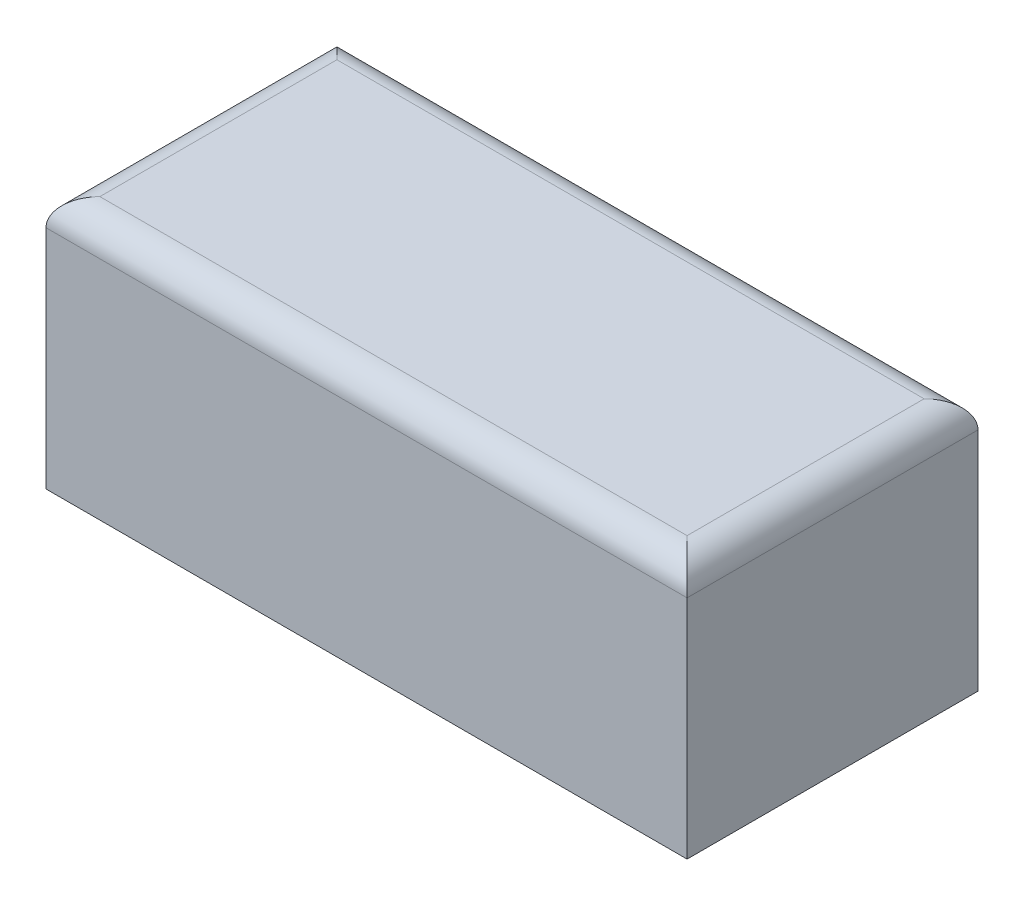
ISO-10303-21;
HEADER;
FILE_DESCRIPTION(('STEP AP214'),'2;1');
FILE_NAME('part.step','',(''),(''),'','','');
FILE_SCHEMA(('AUTOMOTIVE_DESIGN { 1 0 10303 214 1 1 1 1 }'));
ENDSEC;
DATA;
#1=APPLICATION_CONTEXT('core data for automotive mechanical design processes');
#2=APPLICATION_PROTOCOL_DEFINITION('international standard','automotive_design',2000,#1);
#3=PRODUCT_CONTEXT('',#1,'mechanical');
#4=PRODUCT('Part','Part','',(#3));
#5=PRODUCT_RELATED_PRODUCT_CATEGORY('part','',(#4));
#6=PRODUCT_DEFINITION_FORMATION('','',#4);
#7=PRODUCT_DEFINITION_CONTEXT('part definition',#1,'design');
#8=PRODUCT_DEFINITION('design','',#6,#7);
#9=PRODUCT_DEFINITION_SHAPE('','',#8);
#10=(LENGTH_UNIT() NAMED_UNIT(*) SI_UNIT(.MILLI.,.METRE.));
#11=(NAMED_UNIT(*) PLANE_ANGLE_UNIT() SI_UNIT($,.RADIAN.));
#12=(NAMED_UNIT(*) SI_UNIT($,.STERADIAN.) SOLID_ANGLE_UNIT());
#13=UNCERTAINTY_MEASURE_WITH_UNIT(LENGTH_MEASURE(1.E-05),#10,'distance_accuracy_value','');
#14=(GEOMETRIC_REPRESENTATION_CONTEXT(3) GLOBAL_UNCERTAINTY_ASSIGNED_CONTEXT((#13)) GLOBAL_UNIT_ASSIGNED_CONTEXT((#10,
#11,#12)) REPRESENTATION_CONTEXT('',''));
#15=CARTESIAN_POINT('',(0.,0.,0.));
#16=DIRECTION('',(0.,0.,1.));
#17=DIRECTION('',(1.,0.,0.));
#18=AXIS2_PLACEMENT_3D('',#15,#16,#17);
#19=CARTESIAN_POINT('',(0.,8.,0.));
#20=DIRECTION('',(0.,1.,0.));
#21=DIRECTION('',(0.,0.,1.));
#22=AXIS2_PLACEMENT_3D('',#19,#20,#21);
#23=PLANE('',#22);
#24=DIRECTION('',(1.,0.,0.));
#25=VECTOR('',#24,1.);
#26=CARTESIAN_POINT('',(0.,8.,-51.5));
#27=LINE('',#26,#25);
#28=CARTESIAN_POINT('',(-1.5,8.,-51.5));
#29=VERTEX_POINT('',#28);
#30=CARTESIAN_POINT('',(116.5,8.,-51.5));
#31=VERTEX_POINT('',#30);
#32=EDGE_CURVE('E164',#29,#31,#27,.T.);
#33=ORIENTED_EDGE('',*,*,#32,.F.);
#34=DIRECTION('',(0.,0.,-1.));
#35=VECTOR('',#34,1.);
#36=CARTESIAN_POINT('',(-1.5,8.,0.));
#37=LINE('',#36,#35);
#38=CARTESIAN_POINT('',(-1.5,8.,1.5));
#39=VERTEX_POINT('',#38);
#40=EDGE_CURVE('E145',#39,#29,#37,.T.);
#41=ORIENTED_EDGE('',*,*,#40,.F.);
#42=DIRECTION('',(-1.,0.,0.));
#43=VECTOR('',#42,1.);
#44=CARTESIAN_POINT('',(0.,8.,1.5));
#45=LINE('',#44,#43);
#46=CARTESIAN_POINT('',(116.5,8.,1.5));
#47=VERTEX_POINT('',#46);
#48=EDGE_CURVE('E157',#47,#39,#45,.T.);
#49=ORIENTED_EDGE('',*,*,#48,.F.);
#50=DIRECTION('',(0.,0.,1.));
#51=VECTOR('',#50,1.);
#52=CARTESIAN_POINT('',(116.5,8.,0.));
#53=LINE('',#52,#51);
#54=EDGE_CURVE('E166',#31,#47,#53,.T.);
#55=ORIENTED_EDGE('',*,*,#54,.F.);
#56=EDGE_LOOP('',(#33,#41,#49,#55));
#57=FACE_BOUND('',#56,.T.);
#58=DIRECTION('',(0.,0.,1.));
#59=VECTOR('',#58,1.);
#60=CARTESIAN_POINT('',(-2.,8.,-52.));
#61=LINE('',#60,#59);
#62=CARTESIAN_POINT('',(-2.,8.,-52.));
#63=VERTEX_POINT('',#62);
#64=CARTESIAN_POINT('',(-1.99999999999999,8.,2.));
#65=VERTEX_POINT('',#64);
#66=EDGE_CURVE('E213',#63,#65,#61,.T.);
#67=ORIENTED_EDGE('',*,*,#66,.F.);
#68=DIRECTION('',(-1.,0.,0.));
#69=VECTOR('',#68,1.);
#70=CARTESIAN_POINT('',(117.,8.,-52.));
#71=LINE('',#70,#69);
#72=CARTESIAN_POINT('',(117.,8.,-52.));
#73=VERTEX_POINT('',#72);
#74=EDGE_CURVE('E222',#73,#63,#71,.T.);
#75=ORIENTED_EDGE('',*,*,#74,.F.);
#76=DIRECTION('',(0.,0.,-1.));
#77=VECTOR('',#76,1.);
#78=CARTESIAN_POINT('',(117.,8.,1.99999999999999));
#79=LINE('',#78,#77);
#80=CARTESIAN_POINT('',(117.,8.,1.99999999999999));
#81=VERTEX_POINT('',#80);
#82=EDGE_CURVE('E219',#81,#73,#79,.T.);
#83=ORIENTED_EDGE('',*,*,#82,.F.);
#84=DIRECTION('',(1.,0.,0.));
#85=VECTOR('',#84,1.);
#86=CARTESIAN_POINT('',(-1.99999999999999,8.,2.));
#87=LINE('',#86,#85);
#88=EDGE_CURVE('E216',#65,#81,#87,.T.);
#89=ORIENTED_EDGE('',*,*,#88,.F.);
#90=EDGE_LOOP('',(#67,#75,#83,#89));
#91=FACE_BOUND('',#90,.T.);
#92=ADVANCED_FACE('F39',(#57,#91),#23,.F.);
#93=CARTESIAN_POINT('',(-2.,53.,-52.));
#94=DIRECTION('',(1.,0.,0.));
#95=DIRECTION('',(0.,0.,-1.));
#96=AXIS2_PLACEMENT_3D('',#93,#94,#95);
#97=PLANE('',#96);
#98=DIRECTION('',(0.,-1.,0.));
#99=VECTOR('',#98,1.);
#100=CARTESIAN_POINT('',(-1.99999999999999,53.,2.));
#101=LINE('',#100,#99);
#102=CARTESIAN_POINT('',(-1.99999999999999,50.,2.));
#103=VERTEX_POINT('',#102);
#104=EDGE_CURVE('E231',#103,#65,#101,.T.);
#105=ORIENTED_EDGE('',*,*,#104,.F.);
#106=DIRECTION('',(0.,0.,1.));
#107=VECTOR('',#106,1.);
#108=CARTESIAN_POINT('',(-2.,50.,-52.));
#109=LINE('',#108,#107);
#110=CARTESIAN_POINT('',(-2.,50.,-52.));
#111=VERTEX_POINT('',#110);
#112=EDGE_CURVE('E48',#103,#111,#109,.F.);
#113=ORIENTED_EDGE('',*,*,#112,.T.);
#114=DIRECTION('',(0.,-1.,0.));
#115=VECTOR('',#114,1.);
#116=CARTESIAN_POINT('',(-2.,53.,-52.));
#117=LINE('',#116,#115);
#118=EDGE_CURVE('E225',#111,#63,#117,.T.);
#119=ORIENTED_EDGE('',*,*,#118,.T.);
#120=ORIENTED_EDGE('',*,*,#66,.T.);
#121=EDGE_LOOP('',(#105,#113,#119,#120));
#122=FACE_BOUND('',#121,.T.);
#123=ADVANCED_FACE('F294',(#122),#97,.F.);
#124=CARTESIAN_POINT('',(-1.99999999999999,53.,2.));
#125=DIRECTION('',(0.,0.,-1.));
#126=DIRECTION('',(-1.,0.,0.));
#127=AXIS2_PLACEMENT_3D('',#124,#125,#126);
#128=PLANE('',#127);
#129=DIRECTION('',(0.,-1.,0.));
#130=VECTOR('',#129,1.);
#131=CARTESIAN_POINT('',(117.,53.,1.99999999999999));
#132=LINE('',#131,#130);
#133=CARTESIAN_POINT('',(117.,50.,1.99999999999999));
#134=VERTEX_POINT('',#133);
#135=EDGE_CURVE('E229',#134,#81,#132,.T.);
#136=ORIENTED_EDGE('',*,*,#135,.F.);
#137=DIRECTION('',(1.,0.,0.));
#138=VECTOR('',#137,1.);
#139=CARTESIAN_POINT('',(-1.99999999999999,50.,2.));
#140=LINE('',#139,#138);
#141=EDGE_CURVE('E63',#134,#103,#140,.F.);
#142=ORIENTED_EDGE('',*,*,#141,.T.);
#143=ORIENTED_EDGE('',*,*,#104,.T.);
#144=ORIENTED_EDGE('',*,*,#88,.T.);
#145=EDGE_LOOP('',(#136,#142,#143,#144));
#146=FACE_BOUND('',#145,.T.);
#147=ADVANCED_FACE('F301',(#146),#128,.F.);
#148=CARTESIAN_POINT('',(117.,53.,1.99999999999999));
#149=DIRECTION('',(-1.,0.,0.));
#150=DIRECTION('',(0.,0.,1.));
#151=AXIS2_PLACEMENT_3D('',#148,#149,#150);
#152=PLANE('',#151);
#153=DIRECTION('',(0.,-1.,0.));
#154=VECTOR('',#153,1.);
#155=CARTESIAN_POINT('',(117.,53.,-52.));
#156=LINE('',#155,#154);
#157=CARTESIAN_POINT('',(117.,50.,-52.));
#158=VERTEX_POINT('',#157);
#159=EDGE_CURVE('E227',#158,#73,#156,.T.);
#160=ORIENTED_EDGE('',*,*,#159,.F.);
#161=DIRECTION('',(0.,0.,-1.));
#162=VECTOR('',#161,1.);
#163=CARTESIAN_POINT('',(117.,50.,1.99999999999999));
#164=LINE('',#163,#162);
#165=EDGE_CURVE('E244',#158,#134,#164,.F.);
#166=ORIENTED_EDGE('',*,*,#165,.T.);
#167=ORIENTED_EDGE('',*,*,#135,.T.);
#168=ORIENTED_EDGE('',*,*,#82,.T.);
#169=EDGE_LOOP('',(#160,#166,#167,#168));
#170=FACE_BOUND('',#169,.T.);
#171=ADVANCED_FACE('F273',(#170),#152,.F.);
#172=CARTESIAN_POINT('',(117.,53.,-52.));
#173=DIRECTION('',(0.,0.,1.));
#174=DIRECTION('',(1.,0.,0.));
#175=AXIS2_PLACEMENT_3D('',#172,#173,#174);
#176=PLANE('',#175);
#177=ORIENTED_EDGE('',*,*,#118,.F.);
#178=DIRECTION('',(-1.,0.,0.));
#179=VECTOR('',#178,1.);
#180=CARTESIAN_POINT('',(117.,50.,-52.));
#181=LINE('',#180,#179);
#182=EDGE_CURVE('E12',#111,#158,#181,.F.);
#183=ORIENTED_EDGE('',*,*,#182,.T.);
#184=ORIENTED_EDGE('',*,*,#159,.T.);
#185=ORIENTED_EDGE('',*,*,#74,.T.);
#186=EDGE_LOOP('',(#177,#183,#184,#185));
#187=FACE_BOUND('',#186,.T.);
#188=ADVANCED_FACE('F270',(#187),#176,.F.);
#189=CARTESIAN_POINT('',(0.,55.,0.));
#190=DIRECTION('',(0.,1.,0.));
#191=DIRECTION('',(0.,0.,1.));
#192=AXIS2_PLACEMENT_3D('',#189,#190,#191);
#193=PLANE('',#192);
#194=DIRECTION('',(1.,0.,0.));
#195=VECTOR('',#194,1.);
#196=CARTESIAN_POINT('',(117.,55.,-3.00000000000001));
#197=LINE('',#196,#195);
#198=CARTESIAN_POINT('',(3.00000000000001,55.,-3.));
#199=VERTEX_POINT('',#198);
#200=CARTESIAN_POINT('',(112.,55.,-3.00000000000001));
#201=VERTEX_POINT('',#200);
#202=EDGE_CURVE('E239',#199,#201,#197,.T.);
#203=ORIENTED_EDGE('',*,*,#202,.T.);
#204=DIRECTION('',(0.,0.,-1.));
#205=VECTOR('',#204,1.);
#206=CARTESIAN_POINT('',(112.,55.,-52.));
#207=LINE('',#206,#205);
#208=CARTESIAN_POINT('',(112.,55.,-47.));
#209=VERTEX_POINT('',#208);
#210=EDGE_CURVE('E241',#201,#209,#207,.T.);
#211=ORIENTED_EDGE('',*,*,#210,.T.);
#212=DIRECTION('',(-1.,0.,0.));
#213=VECTOR('',#212,1.);
#214=CARTESIAN_POINT('',(-2.,55.,-47.));
#215=LINE('',#214,#213);
#216=CARTESIAN_POINT('',(3.,55.,-47.));
#217=VERTEX_POINT('',#216);
#218=EDGE_CURVE('E235',#209,#217,#215,.T.);
#219=ORIENTED_EDGE('',*,*,#218,.T.);
#220=DIRECTION('',(0.,0.,1.));
#221=VECTOR('',#220,1.);
#222=CARTESIAN_POINT('',(3.00000000000001,55.,2.));
#223=LINE('',#222,#221);
#224=EDGE_CURVE('E237',#217,#199,#223,.T.);
#225=ORIENTED_EDGE('',*,*,#224,.T.);
#226=EDGE_LOOP('',(#203,#211,#219,#225));
#227=FACE_BOUND('',#226,.T.);
#228=ADVANCED_FACE('F280',(#227),#193,.T.);
#229=CARTESIAN_POINT('',(-1.5,8.,0.));
#230=DIRECTION('',(-0.998629534754574,0.0523359562429438,0.));
#231=DIRECTION('',(-0.0523359562429438,-0.998629534754574,0.));
#232=AXIS2_PLACEMENT_3D('',#229,#230,#231);
#233=PLANE('',#232);
#234=ORIENTED_EDGE('',*,*,#40,.T.);
#235=DIRECTION('',(-0.0522644276887139,-0.997264688634237,-0.0522644276887139));
#236=VECTOR('',#235,1.);
#237=CARTESIAN_POINT('',(-1.35932412431612,10.68425561259,-51.3593241243161));
#238=LINE('',#237,#236);
#239=CARTESIAN_POINT('',(-1.39518444143392,10.,-51.3951844414339));
#240=VERTEX_POINT('',#239);
#241=EDGE_CURVE('E172',#240,#29,#238,.T.);
#242=ORIENTED_EDGE('',*,*,#241,.F.);
#243=DIRECTION('',(0.,0.,-1.));
#244=VECTOR('',#243,1.);
#245=CARTESIAN_POINT('',(-1.39518444143392,10.,0.));
#246=LINE('',#245,#244);
#247=CARTESIAN_POINT('',(-1.39518444143392,10.,1.39518444143392));
#248=VERTEX_POINT('',#247);
#249=EDGE_CURVE('E148',#248,#240,#246,.T.);
#250=ORIENTED_EDGE('',*,*,#249,.F.);
#251=DIRECTION('',(-0.0522644276887139,-0.997264688634237,0.0522644276887139));
#252=VECTOR('',#251,1.);
#253=CARTESIAN_POINT('',(-1.49590264439756,8.07818220230845,1.49590264439756));
#254=LINE('',#253,#252);
#255=EDGE_CURVE('E141',#248,#39,#254,.T.);
#256=ORIENTED_EDGE('',*,*,#255,.T.);
#257=EDGE_LOOP('',(#234,#242,#250,#256));
#258=FACE_BOUND('',#257,.T.);
#259=ADVANCED_FACE('F143',(#258),#233,.F.);
#260=CARTESIAN_POINT('',(0.,8.,-51.5));
#261=DIRECTION('',(0.,0.0523359562429438,-0.998629534754574));
#262=DIRECTION('',(0.,0.998629534754574,0.0523359562429438));
#263=AXIS2_PLACEMENT_3D('',#260,#261,#262);
#264=PLANE('',#263);
#265=ORIENTED_EDGE('',*,*,#32,.T.);
#266=DIRECTION('',(0.0522644276887139,-0.997264688634237,-0.0522644276887139));
#267=VECTOR('',#266,1.);
#268=CARTESIAN_POINT('',(116.18177204821,14.0721510459561,-51.1817720482102));
#269=LINE('',#268,#267);
#270=CARTESIAN_POINT('',(116.395184441434,10.,-51.3951844414339));
#271=VERTEX_POINT('',#270);
#272=EDGE_CURVE('E170',#271,#31,#269,.T.);
#273=ORIENTED_EDGE('',*,*,#272,.F.);
#274=DIRECTION('',(1.,0.,0.));
#275=VECTOR('',#274,1.);
#276=CARTESIAN_POINT('',(0.,10.,-51.3951844414339));
#277=LINE('',#276,#275);
#278=EDGE_CURVE('E178',#240,#271,#277,.T.);
#279=ORIENTED_EDGE('',*,*,#278,.F.);
#280=ORIENTED_EDGE('',*,*,#241,.T.);
#281=EDGE_LOOP('',(#265,#273,#279,#280));
#282=FACE_BOUND('',#281,.T.);
#283=ADVANCED_FACE('F288',(#282),#264,.F.);
#284=CARTESIAN_POINT('',(116.5,8.,0.));
#285=DIRECTION('',(0.998629534754574,0.0523359562429438,0.));
#286=DIRECTION('',(-0.0523359562429438,0.998629534754574,0.));
#287=AXIS2_PLACEMENT_3D('',#284,#285,#286);
#288=PLANE('',#287);
#289=ORIENTED_EDGE('',*,*,#54,.T.);
#290=DIRECTION('',(0.0522644276887139,-0.997264688634237,0.0522644276887139));
#291=VECTOR('',#290,1.);
#292=CARTESIAN_POINT('',(116.495902644398,8.07818220230845,1.49590264439756));
#293=LINE('',#292,#291);
#294=CARTESIAN_POINT('',(116.395184441434,10.,1.39518444143392));
#295=VERTEX_POINT('',#294);
#296=EDGE_CURVE('E152',#295,#47,#293,.T.);
#297=ORIENTED_EDGE('',*,*,#296,.F.);
#298=DIRECTION('',(0.,0.,1.));
#299=VECTOR('',#298,1.);
#300=CARTESIAN_POINT('',(116.395184441434,10.,0.));
#301=LINE('',#300,#299);
#302=EDGE_CURVE('E153',#271,#295,#301,.T.);
#303=ORIENTED_EDGE('',*,*,#302,.F.);
#304=ORIENTED_EDGE('',*,*,#272,.T.);
#305=EDGE_LOOP('',(#289,#297,#303,#304));
#306=FACE_BOUND('',#305,.T.);
#307=ADVANCED_FACE('F365',(#306),#288,.F.);
#308=CARTESIAN_POINT('',(0.,8.,1.5));
#309=DIRECTION('',(0.,0.0523359562429438,0.998629534754574));
#310=DIRECTION('',(0.,-0.998629534754574,0.0523359562429438));
#311=AXIS2_PLACEMENT_3D('',#308,#309,#310);
#312=PLANE('',#311);
#313=ORIENTED_EDGE('',*,*,#48,.T.);
#314=ORIENTED_EDGE('',*,*,#255,.F.);
#315=DIRECTION('',(-1.,0.,0.));
#316=VECTOR('',#315,1.);
#317=CARTESIAN_POINT('',(0.,10.,1.39518444143392));
#318=LINE('',#317,#316);
#319=EDGE_CURVE('E182',#295,#248,#318,.T.);
#320=ORIENTED_EDGE('',*,*,#319,.F.);
#321=ORIENTED_EDGE('',*,*,#296,.T.);
#322=EDGE_LOOP('',(#313,#314,#320,#321));
#323=FACE_BOUND('',#322,.T.);
#324=ADVANCED_FACE('F158',(#323),#312,.F.);
#325=CARTESIAN_POINT('',(0.,10.,0.));
#326=DIRECTION('',(0.,1.,0.));
#327=DIRECTION('',(0.,0.,1.));
#328=AXIS2_PLACEMENT_3D('',#325,#326,#327);
#329=PLANE('',#328);
#330=DIRECTION('',(-1.,0.,0.));
#331=VECTOR('',#330,1.);
#332=CARTESIAN_POINT('',(115.5,10.,-50.5));
#333=LINE('',#332,#331);
#334=CARTESIAN_POINT('',(115.5,10.,-50.5));
#335=VERTEX_POINT('',#334);
#336=CARTESIAN_POINT('',(-0.5,10.,-50.5));
#337=VERTEX_POINT('',#336);
#338=EDGE_CURVE('E187',#335,#337,#333,.T.);
#339=ORIENTED_EDGE('',*,*,#338,.T.);
#340=DIRECTION('',(0.,0.,1.));
#341=VECTOR('',#340,1.);
#342=CARTESIAN_POINT('',(-0.5,10.,-50.5));
#343=LINE('',#342,#341);
#344=CARTESIAN_POINT('',(-0.5,10.,0.5));
#345=VERTEX_POINT('',#344);
#346=EDGE_CURVE('E185',#337,#345,#343,.T.);
#347=ORIENTED_EDGE('',*,*,#346,.T.);
#348=DIRECTION('',(1.,0.,0.));
#349=VECTOR('',#348,1.);
#350=CARTESIAN_POINT('',(-0.5,10.,0.5));
#351=LINE('',#350,#349);
#352=CARTESIAN_POINT('',(115.5,10.,0.5));
#353=VERTEX_POINT('',#352);
#354=EDGE_CURVE('E174',#345,#353,#351,.T.);
#355=ORIENTED_EDGE('',*,*,#354,.T.);
#356=DIRECTION('',(0.,0.,-1.));
#357=VECTOR('',#356,1.);
#358=CARTESIAN_POINT('',(115.5,10.,-2.5));
#359=LINE('',#358,#357);
#360=EDGE_CURVE('E233',#353,#335,#359,.T.);
#361=ORIENTED_EDGE('',*,*,#360,.T.);
#362=EDGE_LOOP('',(#339,#347,#355,#361));
#363=FACE_BOUND('',#362,.T.);
#364=ORIENTED_EDGE('',*,*,#249,.T.);
#365=ORIENTED_EDGE('',*,*,#278,.T.);
#366=ORIENTED_EDGE('',*,*,#302,.T.);
#367=ORIENTED_EDGE('',*,*,#319,.T.);
#368=EDGE_LOOP('',(#364,#365,#366,#367));
#369=FACE_BOUND('',#368,.T.);
#370=ADVANCED_FACE('F344',(#363,#369),#329,.F.);
#371=CARTESIAN_POINT('',(0.,53.,0.));
#372=DIRECTION('',(0.,1.,0.));
#373=DIRECTION('',(0.,0.,1.));
#374=AXIS2_PLACEMENT_3D('',#371,#372,#373);
#375=PLANE('',#374);
#376=DIRECTION('',(0.,0.,1.));
#377=VECTOR('',#376,1.);
#378=CARTESIAN_POINT('',(-0.5,53.,-50.5));
#379=LINE('',#378,#377);
#380=CARTESIAN_POINT('',(-0.5,53.,-50.5));
#381=VERTEX_POINT('',#380);
#382=CARTESIAN_POINT('',(-0.5,53.,0.5));
#383=VERTEX_POINT('',#382);
#384=EDGE_CURVE('E195',#381,#383,#379,.T.);
#385=ORIENTED_EDGE('',*,*,#384,.F.);
#386=DIRECTION('',(-1.,0.,0.));
#387=VECTOR('',#386,1.);
#388=CARTESIAN_POINT('',(115.5,53.,-50.5));
#389=LINE('',#388,#387);
#390=CARTESIAN_POINT('',(115.5,53.,-50.5));
#391=VERTEX_POINT('',#390);
#392=EDGE_CURVE('E192',#391,#381,#389,.T.);
#393=ORIENTED_EDGE('',*,*,#392,.F.);
#394=DIRECTION('',(0.,0.,-1.));
#395=VECTOR('',#394,1.);
#396=CARTESIAN_POINT('',(115.5,53.,-47.5));
#397=LINE('',#396,#395);
#398=CARTESIAN_POINT('',(115.5,53.,0.5));
#399=VERTEX_POINT('',#398);
#400=EDGE_CURVE('E189',#399,#391,#397,.T.);
#401=ORIENTED_EDGE('',*,*,#400,.F.);
#402=DIRECTION('',(1.,0.,0.));
#403=VECTOR('',#402,1.);
#404=CARTESIAN_POINT('',(-0.5,53.,0.5));
#405=LINE('',#404,#403);
#406=EDGE_CURVE('E198',#383,#399,#405,.T.);
#407=ORIENTED_EDGE('',*,*,#406,.F.);
#408=EDGE_LOOP('',(#385,#393,#401,#407));
#409=FACE_BOUND('',#408,.T.);
#410=ADVANCED_FACE('F341',(#409),#375,.F.);
#411=CARTESIAN_POINT('',(115.5,53.,-2.5));
#412=DIRECTION('',(-1.,0.,0.));
#413=DIRECTION('',(0.,0.,1.));
#414=AXIS2_PLACEMENT_3D('',#411,#412,#413);
#415=PLANE('',#414);
#416=ORIENTED_EDGE('',*,*,#360,.F.);
#417=DIRECTION('',(0.,-1.,0.));
#418=VECTOR('',#417,1.);
#419=CARTESIAN_POINT('',(115.5,53.,0.5));
#420=LINE('',#419,#418);
#421=EDGE_CURVE('E201',#399,#353,#420,.T.);
#422=ORIENTED_EDGE('',*,*,#421,.F.);
#423=ORIENTED_EDGE('',*,*,#400,.T.);
#424=DIRECTION('',(0.,-1.,0.));
#425=VECTOR('',#424,1.);
#426=CARTESIAN_POINT('',(115.5,53.,-50.5));
#427=LINE('',#426,#425);
#428=EDGE_CURVE('E210',#391,#335,#427,.T.);
#429=ORIENTED_EDGE('',*,*,#428,.T.);
#430=EDGE_LOOP('',(#416,#422,#423,#429));
#431=FACE_BOUND('',#430,.T.);
#432=ADVANCED_FACE('F338',(#431),#415,.T.);
#433=CARTESIAN_POINT('',(-0.5,53.,0.5));
#434=DIRECTION('',(0.,0.,-1.));
#435=DIRECTION('',(-1.,0.,0.));
#436=AXIS2_PLACEMENT_3D('',#433,#434,#435);
#437=PLANE('',#436);
#438=ORIENTED_EDGE('',*,*,#354,.F.);
#439=DIRECTION('',(0.,-1.,0.));
#440=VECTOR('',#439,1.);
#441=CARTESIAN_POINT('',(-0.5,53.,0.5));
#442=LINE('',#441,#440);
#443=EDGE_CURVE('E204',#383,#345,#442,.T.);
#444=ORIENTED_EDGE('',*,*,#443,.F.);
#445=ORIENTED_EDGE('',*,*,#406,.T.);
#446=ORIENTED_EDGE('',*,*,#421,.T.);
#447=EDGE_LOOP('',(#438,#444,#445,#446));
#448=FACE_BOUND('',#447,.T.);
#449=ADVANCED_FACE('F329',(#448),#437,.T.);
#450=CARTESIAN_POINT('',(-0.5,53.,-50.5));
#451=DIRECTION('',(1.,0.,0.));
#452=DIRECTION('',(0.,0.,-1.));
#453=AXIS2_PLACEMENT_3D('',#450,#451,#452);
#454=PLANE('',#453);
#455=ORIENTED_EDGE('',*,*,#346,.F.);
#456=DIRECTION('',(0.,-1.,0.));
#457=VECTOR('',#456,1.);
#458=CARTESIAN_POINT('',(-0.5,53.,-50.5));
#459=LINE('',#458,#457);
#460=EDGE_CURVE('E207',#381,#337,#459,.T.);
#461=ORIENTED_EDGE('',*,*,#460,.F.);
#462=ORIENTED_EDGE('',*,*,#384,.T.);
#463=ORIENTED_EDGE('',*,*,#443,.T.);
#464=EDGE_LOOP('',(#455,#461,#462,#463));
#465=FACE_BOUND('',#464,.T.);
#466=ADVANCED_FACE('F323',(#465),#454,.T.);
#467=CARTESIAN_POINT('',(115.5,53.,-50.5));
#468=DIRECTION('',(0.,0.,1.));
#469=DIRECTION('',(1.,0.,0.));
#470=AXIS2_PLACEMENT_3D('',#467,#468,#469);
#471=PLANE('',#470);
#472=ORIENTED_EDGE('',*,*,#338,.F.);
#473=ORIENTED_EDGE('',*,*,#428,.F.);
#474=ORIENTED_EDGE('',*,*,#392,.T.);
#475=ORIENTED_EDGE('',*,*,#460,.T.);
#476=EDGE_LOOP('',(#472,#473,#474,#475));
#477=FACE_BOUND('',#476,.T.);
#478=ADVANCED_FACE('F304',(#477),#471,.T.);
#479=CARTESIAN_POINT('',(3.00000000000001,50.,0.));
#480=DIRECTION('',(0.,0.,-1.));
#481=DIRECTION('',(-1.,0.,0.));
#482=AXIS2_PLACEMENT_3D('',#479,#480,#481);
#483=CYLINDRICAL_SURFACE('',#482,5.);
#484=CARTESIAN_POINT('',(3.,50.,-47.));
#485=DIRECTION('',(0.707106781186547,0.,-0.707106781186548));
#486=DIRECTION('',(0.707106781186548,0.,0.707106781186547));
#487=AXIS2_PLACEMENT_3D('',#484,#485,#486);
#488=ELLIPSE('',#487,7.07106781186547,5.);
#489=EDGE_CURVE('E252',#111,#217,#488,.T.);
#490=ORIENTED_EDGE('',*,*,#489,.F.);
#491=ORIENTED_EDGE('',*,*,#112,.F.);
#492=CARTESIAN_POINT('',(3.,50.,-3.));
#493=DIRECTION('',(-0.707106781186548,0.,-0.707106781186547));
#494=DIRECTION('',(0.707106781186547,0.,-0.707106781186548));
#495=AXIS2_PLACEMENT_3D('',#492,#493,#494);
#496=ELLIPSE('',#495,7.07106781186547,5.);
#497=EDGE_CURVE('E43',#199,#103,#496,.F.);
#498=ORIENTED_EDGE('',*,*,#497,.F.);
#499=ORIENTED_EDGE('',*,*,#224,.F.);
#500=EDGE_LOOP('',(#490,#491,#498,#499));
#501=FACE_BOUND('',#500,.T.);
#502=ADVANCED_FACE('F41',(#501),#483,.T.);
#503=CARTESIAN_POINT('',(0.,50.,-3.));
#504=DIRECTION('',(-1.,0.,0.));
#505=DIRECTION('',(0.,0.,1.));
#506=AXIS2_PLACEMENT_3D('',#503,#504,#505);
#507=CYLINDRICAL_SURFACE('',#506,5.);
#508=ORIENTED_EDGE('',*,*,#497,.T.);
#509=ORIENTED_EDGE('',*,*,#141,.F.);
#510=CARTESIAN_POINT('',(112.,50.,-3.00000000000001));
#511=DIRECTION('',(-0.707106781186547,0.,0.707106781186547));
#512=DIRECTION('',(-0.707106781186548,0.,-0.707106781186547));
#513=AXIS2_PLACEMENT_3D('',#510,#511,#512);
#514=ELLIPSE('',#513,7.07106781186547,5.);
#515=EDGE_CURVE('E251',#201,#134,#514,.F.);
#516=ORIENTED_EDGE('',*,*,#515,.F.);
#517=ORIENTED_EDGE('',*,*,#202,.F.);
#518=EDGE_LOOP('',(#508,#509,#516,#517));
#519=FACE_BOUND('',#518,.T.);
#520=ADVANCED_FACE('F262',(#519),#507,.T.);
#521=CARTESIAN_POINT('',(0.,50.,-47.));
#522=DIRECTION('',(1.,0.,0.));
#523=DIRECTION('',(0.,0.,-1.));
#524=AXIS2_PLACEMENT_3D('',#521,#522,#523);
#525=CYLINDRICAL_SURFACE('',#524,5.);
#526=ORIENTED_EDGE('',*,*,#489,.T.);
#527=ORIENTED_EDGE('',*,*,#218,.F.);
#528=CARTESIAN_POINT('',(112.,50.,-47.));
#529=DIRECTION('',(0.707106781186548,0.,0.707106781186547));
#530=DIRECTION('',(0.707106781186547,0.,-0.707106781186548));
#531=AXIS2_PLACEMENT_3D('',#528,#529,#530);
#532=ELLIPSE('',#531,7.07106781186548,5.);
#533=EDGE_CURVE('E249',#158,#209,#532,.T.);
#534=ORIENTED_EDGE('',*,*,#533,.F.);
#535=ORIENTED_EDGE('',*,*,#182,.F.);
#536=EDGE_LOOP('',(#526,#527,#534,#535));
#537=FACE_BOUND('',#536,.T.);
#538=ADVANCED_FACE('F267',(#537),#525,.T.);
#539=CARTESIAN_POINT('',(112.,50.,0.));
#540=DIRECTION('',(0.,0.,1.));
#541=DIRECTION('',(1.,0.,0.));
#542=AXIS2_PLACEMENT_3D('',#539,#540,#541);
#543=CYLINDRICAL_SURFACE('',#542,5.);
#544=ORIENTED_EDGE('',*,*,#515,.T.);
#545=ORIENTED_EDGE('',*,*,#165,.F.);
#546=ORIENTED_EDGE('',*,*,#533,.T.);
#547=ORIENTED_EDGE('',*,*,#210,.F.);
#548=EDGE_LOOP('',(#544,#545,#546,#547));
#549=FACE_BOUND('',#548,.T.);
#550=ADVANCED_FACE('F277',(#549),#543,.T.);
#551=CLOSED_SHELL('',(#92,#123,#147,#171,#188,#228,#259,#283,#307,#324,#370,#410,#432,#449,#466,
#478,#502,#520,#538,#550));
#552=MANIFOLD_SOLID_BREP('B2',#551);
#553=ADVANCED_BREP_SHAPE_REPRESENTATION('',(#18,#552),#14);
#554=SHAPE_DEFINITION_REPRESENTATION(#9,#553);
ENDSEC;
END-ISO-10303-21;
